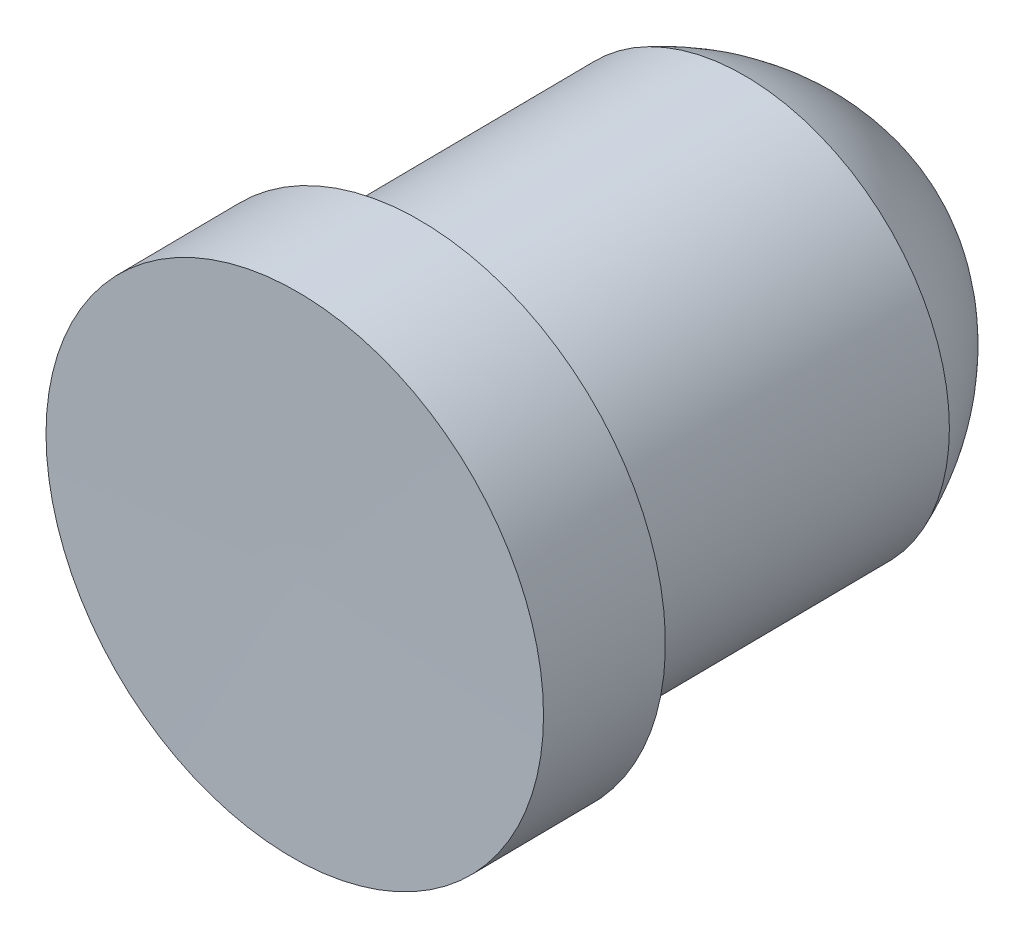
ISO-10303-21;
HEADER;
FILE_DESCRIPTION(('STEP AP214'),'2;1');
FILE_NAME('part.step','',(''),(''),'','','');
FILE_SCHEMA(('AUTOMOTIVE_DESIGN { 1 0 10303 214 1 1 1 1 }'));
ENDSEC;
DATA;
#1=APPLICATION_CONTEXT('core data for automotive mechanical design processes');
#2=APPLICATION_PROTOCOL_DEFINITION('international standard','automotive_design',2000,#1);
#3=PRODUCT_CONTEXT('',#1,'mechanical');
#4=PRODUCT('Part','Part','',(#3));
#5=PRODUCT_RELATED_PRODUCT_CATEGORY('part','',(#4));
#6=PRODUCT_DEFINITION_FORMATION('','',#4);
#7=PRODUCT_DEFINITION_CONTEXT('part definition',#1,'design');
#8=PRODUCT_DEFINITION('design','',#6,#7);
#9=PRODUCT_DEFINITION_SHAPE('','',#8);
#10=(LENGTH_UNIT() NAMED_UNIT(*) SI_UNIT(.MILLI.,.METRE.));
#11=(NAMED_UNIT(*) PLANE_ANGLE_UNIT() SI_UNIT($,.RADIAN.));
#12=(NAMED_UNIT(*) SI_UNIT($,.STERADIAN.) SOLID_ANGLE_UNIT());
#13=UNCERTAINTY_MEASURE_WITH_UNIT(LENGTH_MEASURE(1.E-05),#10,'distance_accuracy_value','');
#14=(GEOMETRIC_REPRESENTATION_CONTEXT(3) GLOBAL_UNCERTAINTY_ASSIGNED_CONTEXT((#13)) GLOBAL_UNIT_ASSIGNED_CONTEXT((#10,
#11,#12)) REPRESENTATION_CONTEXT('',''));
#15=CARTESIAN_POINT('',(0.,0.,0.));
#16=DIRECTION('',(0.,0.,1.));
#17=DIRECTION('',(1.,0.,0.));
#18=AXIS2_PLACEMENT_3D('',#15,#16,#17);
#19=CARTESIAN_POINT('',(2.81052566354794,0.,-28.0463010147409));
#20=DIRECTION('',(0.0101826620215542,0.,0.999948155353144));
#21=DIRECTION('',(0.999948155353144,0.,-0.0101826620215542));
#22=AXIS2_PLACEMENT_3D('',#19,#20,#21);
#23=CONICAL_SURFACE('',#22,0.,1.56016568581608);
#24=CARTESIAN_POINT('',(2.81085042045416,0.,-28.0144095438635));
#25=DIRECTION('',(-0.0101826620215542,0.,-0.999948155353144));
#26=DIRECTION('',(-0.999948155353144,0.,0.0101826620215542));
#27=AXIS2_PLACEMENT_3D('',#24,#25,#26);
#28=CIRCLE('',#27,3.);
#29=CARTESIAN_POINT('',(-0.188994045605271,0.,-27.9838615577989));
#30=VERTEX_POINT('',#29);
#31=EDGE_CURVE('E11',#30,#30,#28,.T.);
#32=ORIENTED_EDGE('',*,*,#31,.F.);
#33=EDGE_LOOP('',(#32));
#34=FACE_BOUND('',#33,.T.);
#35=CARTESIAN_POINT('',(2.81052566354794,0.,-28.0463010147409));
#36=VERTEX_POINT('',#35);
#37=VERTEX_LOOP('',#36);
#38=FACE_BOUND('',#37,.T.);
#39=ADVANCED_FACE('F35',(#34,#38),#23,.F.);
#40=CARTESIAN_POINT('',(2.70263212917345,0.,-38.641559940543));
#41=DIRECTION('',(-0.0101826620215542,0.,-0.999948155353144));
#42=DIRECTION('',(-0.999948155353144,0.,0.0101826620215542));
#43=AXIS2_PLACEMENT_3D('',#40,#41,#42);
#44=CYLINDRICAL_SURFACE('',#43,3.);
#45=CARTESIAN_POINT('',(2.79557556432018,0.,-29.5144165343857));
#46=DIRECTION('',(-0.0101826620215542,0.,-0.999948155353144));
#47=DIRECTION('',(-0.999948155353144,0.,0.0101826620215542));
#48=AXIS2_PLACEMENT_3D('',#45,#46,#47);
#49=CIRCLE('',#48,3.);
#50=CARTESIAN_POINT('',(-0.204268901739249,0.,-29.4838685483211));
#51=VERTEX_POINT('',#50);
#52=EDGE_CURVE('E42',#51,#51,#49,.T.);
#53=ORIENTED_EDGE('',*,*,#52,.F.);
#54=EDGE_LOOP('',(#53));
#55=FACE_BOUND('',#54,.T.);
#56=ORIENTED_EDGE('',*,*,#31,.T.);
#57=EDGE_LOOP('',(#56));
#58=FACE_BOUND('',#57,.T.);
#59=ADVANCED_FACE('F49',(#55,#58),#44,.T.);
#60=CARTESIAN_POINT('',(2.79557556432018,0.,-29.5144165343857));
#61=DIRECTION('',(0.0101826620215542,0.,0.999948155353144));
#62=DIRECTION('',(0.999948155353144,0.,-0.0101826620215542));
#63=AXIS2_PLACEMENT_3D('',#60,#61,#62);
#64=CONICAL_SURFACE('',#63,3.,1.56016568581607);
#65=CARTESIAN_POINT('',(2.79552143816914,0.,-29.519731779532));
#66=DIRECTION('',(-0.0101826620215542,0.,-0.999948155353144));
#67=DIRECTION('',(-0.999948155353144,0.,0.0101826620215542));
#68=AXIS2_PLACEMENT_3D('',#65,#66,#67);
#69=CIRCLE('',#68,2.5);
#70=CARTESIAN_POINT('',(0.295651049786285,0.,-29.4942751244781));
#71=VERTEX_POINT('',#70);
#72=EDGE_CURVE('E77',#71,#71,#69,.T.);
#73=ORIENTED_EDGE('',*,*,#72,.F.);
#74=EDGE_LOOP('',(#73));
#75=FACE_BOUND('',#74,.T.);
#76=ORIENTED_EDGE('',*,*,#52,.T.);
#77=EDGE_LOOP('',(#76));
#78=FACE_BOUND('',#77,.T.);
#79=ADVANCED_FACE('F54',(#75,#78),#64,.T.);
#80=CARTESIAN_POINT('',(2.70263212917345,0.,-38.641559940543));
#81=DIRECTION('',(-0.0101826620215542,0.,-0.999948155353144));
#82=DIRECTION('',(-0.999948155353144,0.,0.0101826620215542));
#83=AXIS2_PLACEMENT_3D('',#80,#81,#82);
#84=CYLINDRICAL_SURFACE('',#83,2.5);
#85=CARTESIAN_POINT('',(2.75479079008293,0.,-33.5195244009445));
#86=DIRECTION('',(-0.0101826620215542,0.,-0.999948155353144));
#87=DIRECTION('',(-0.999948155353144,0.,0.0101826620215542));
#88=AXIS2_PLACEMENT_3D('',#85,#86,#87);
#89=CIRCLE('',#88,2.5);
#90=CARTESIAN_POINT('',(0.25492040170007,0.,-33.4940677458907));
#91=VERTEX_POINT('',#90);
#92=EDGE_CURVE('E76',#91,#91,#89,.T.);
#93=ORIENTED_EDGE('',*,*,#92,.F.);
#94=EDGE_LOOP('',(#93));
#95=FACE_BOUND('',#94,.T.);
#96=ORIENTED_EDGE('',*,*,#72,.T.);
#97=EDGE_LOOP('',(#96));
#98=FACE_BOUND('',#97,.T.);
#99=ADVANCED_FACE('F61',(#95,#98),#84,.T.);
#100=CARTESIAN_POINT('',(3.28191553895537,0.,-32.3109361221764));
#101=DIRECTION('',(0.,-1.,0.));
#102=DIRECTION('',(-0.999948155353144,0.,0.0101826620215542));
#103=AXIS2_PLACEMENT_3D('',#100,#101,#102);
#104=CIRCLE('',#103,3.25);
#105=TRIMMED_CURVE('',#104,(PARAMETER_VALUE(-1.41172921845105)),
(PARAMETER_VALUE(1.41172921845105)),.T.,.PARAMETER.);
#106=CARTESIAN_POINT('',(2.76715145379119,0.,-32.3056941817098));
#107=DIRECTION('',(-0.0101826620215542,0.,-0.999948155353144));
#108=AXIS1_PLACEMENT('',#106,#107);
#109=SURFACE_OF_REVOLUTION('',#105,#108);
#110=CARTESIAN_POINT('',(2.73447559367421,0.,-35.5144981250586));
#111=VERTEX_POINT('',#110);
#112=VERTEX_LOOP('',#111);
#113=FACE_BOUND('',#112,.T.);
#114=ORIENTED_EDGE('',*,*,#92,.T.);
#115=EDGE_LOOP('',(#114));
#116=FACE_BOUND('',#115,.T.);
#117=ADVANCED_FACE('F68',(#113,#116),#109,.T.);
#118=CLOSED_SHELL('',(#39,#59,#79,#99,#117));
#119=MANIFOLD_SOLID_BREP('B2',#118);
#120=ADVANCED_BREP_SHAPE_REPRESENTATION('',(#18,#119),#14);
#121=SHAPE_DEFINITION_REPRESENTATION(#9,#120);
ENDSEC;
END-ISO-10303-21;
